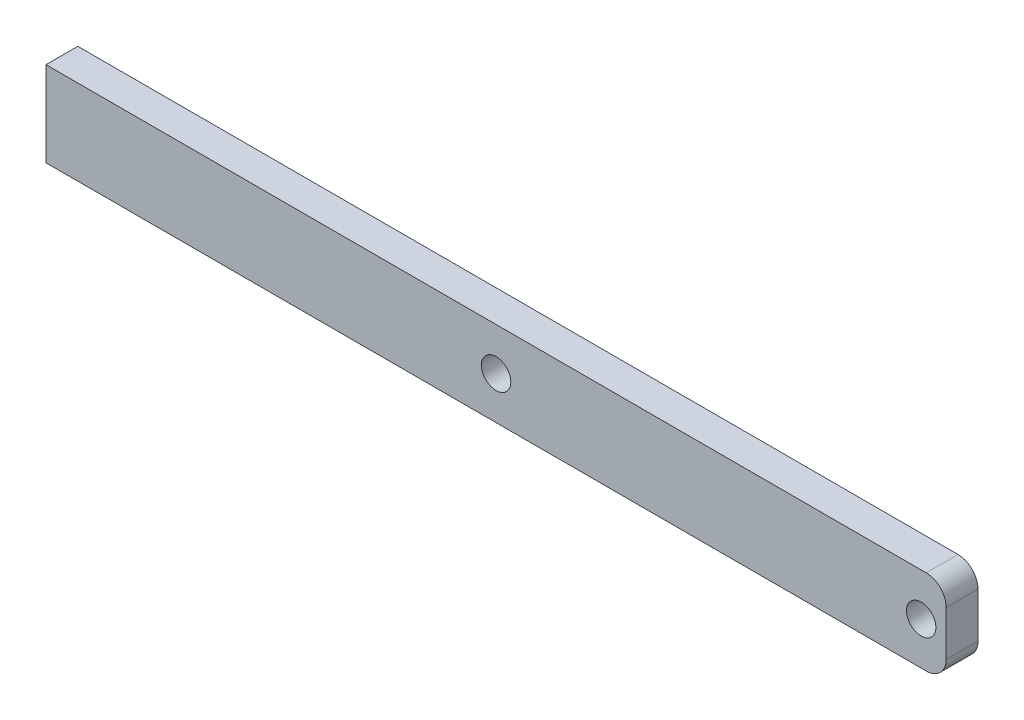
ISO-10303-21;
HEADER;
FILE_DESCRIPTION(('STEP AP214'),'2;1');
FILE_NAME('part.step','',(''),(''),'','','');
FILE_SCHEMA(('AUTOMOTIVE_DESIGN { 1 0 10303 214 1 1 1 1 }'));
ENDSEC;
DATA;
#1=APPLICATION_CONTEXT('core data for automotive mechanical design processes');
#2=APPLICATION_PROTOCOL_DEFINITION('international standard','automotive_design',2000,#1);
#3=PRODUCT_CONTEXT('',#1,'mechanical');
#4=PRODUCT('Part','Part','',(#3));
#5=PRODUCT_RELATED_PRODUCT_CATEGORY('part','',(#4));
#6=PRODUCT_DEFINITION_FORMATION('','',#4);
#7=PRODUCT_DEFINITION_CONTEXT('part definition',#1,'design');
#8=PRODUCT_DEFINITION('design','',#6,#7);
#9=PRODUCT_DEFINITION_SHAPE('','',#8);
#10=(LENGTH_UNIT() NAMED_UNIT(*) SI_UNIT(.MILLI.,.METRE.));
#11=(NAMED_UNIT(*) PLANE_ANGLE_UNIT() SI_UNIT($,.RADIAN.));
#12=(NAMED_UNIT(*) SI_UNIT($,.STERADIAN.) SOLID_ANGLE_UNIT());
#13=UNCERTAINTY_MEASURE_WITH_UNIT(LENGTH_MEASURE(1.E-05),#10,'distance_accuracy_value','');
#14=(GEOMETRIC_REPRESENTATION_CONTEXT(3) GLOBAL_UNCERTAINTY_ASSIGNED_CONTEXT((#13)) GLOBAL_UNIT_ASSIGNED_CONTEXT((#10,
#11,#12)) REPRESENTATION_CONTEXT('',''));
#15=CARTESIAN_POINT('',(0.,0.,0.));
#16=DIRECTION('',(0.,0.,1.));
#17=DIRECTION('',(1.,0.,0.));
#18=AXIS2_PLACEMENT_3D('',#15,#16,#17);
#19=CARTESIAN_POINT('',(0.,0.,3.18));
#20=DIRECTION('',(0.,0.,-1.));
#21=DIRECTION('',(-1.,0.,0.));
#22=AXIS2_PLACEMENT_3D('',#19,#20,#21);
#23=PLANE('',#22);
#24=CARTESIAN_POINT('',(45.,4.25,3.18));
#25=DIRECTION('',(0.,0.,1.));
#26=DIRECTION('',(1.,0.,0.));
#27=AXIS2_PLACEMENT_3D('',#24,#25,#26);
#28=CIRCLE('',#27,1.47);
#29=CARTESIAN_POINT('',(46.47,4.25,3.18));
#30=VERTEX_POINT('',#29);
#31=EDGE_CURVE('E237',#30,#30,#28,.T.);
#32=ORIENTED_EDGE('',*,*,#31,.F.);
#33=EDGE_LOOP('',(#32));
#34=FACE_BOUND('',#33,.T.);
#35=DIRECTION('',(1.,0.,0.));
#36=VECTOR('',#35,1.);
#37=CARTESIAN_POINT('',(0.,0.,3.18));
#38=LINE('',#37,#36);
#39=CARTESIAN_POINT('',(0.,0.,3.18));
#40=VERTEX_POINT('',#39);
#41=CARTESIAN_POINT('',(88.,0.,3.18));
#42=VERTEX_POINT('',#41);
#43=EDGE_CURVE('E86',#40,#42,#38,.T.);
#44=ORIENTED_EDGE('',*,*,#43,.T.);
#45=CARTESIAN_POINT('',(88.,2.,3.18));
#46=DIRECTION('',(0.,0.,-1.));
#47=DIRECTION('',(-1.,0.,0.));
#48=AXIS2_PLACEMENT_3D('',#45,#46,#47);
#49=CIRCLE('',#48,2.);
#50=CARTESIAN_POINT('',(90.,2.,3.18));
#51=VERTEX_POINT('',#50);
#52=EDGE_CURVE('E41',#42,#51,#49,.F.);
#53=ORIENTED_EDGE('',*,*,#52,.T.);
#54=DIRECTION('',(0.,1.,0.));
#55=VECTOR('',#54,1.);
#56=CARTESIAN_POINT('',(90.,0.,3.18));
#57=LINE('',#56,#55);
#58=CARTESIAN_POINT('',(90.,6.5,3.18));
#59=VERTEX_POINT('',#58);
#60=EDGE_CURVE('E93',#51,#59,#57,.T.);
#61=ORIENTED_EDGE('',*,*,#60,.T.);
#62=CARTESIAN_POINT('',(88.,6.5,3.18));
#63=DIRECTION('',(0.,0.,-1.));
#64=DIRECTION('',(-1.,0.,0.));
#65=AXIS2_PLACEMENT_3D('',#62,#63,#64);
#66=CIRCLE('',#65,2.);
#67=CARTESIAN_POINT('',(88.,8.5,3.18));
#68=VERTEX_POINT('',#67);
#69=EDGE_CURVE('E48',#59,#68,#66,.F.);
#70=ORIENTED_EDGE('',*,*,#69,.T.);
#71=DIRECTION('',(-1.,0.,0.));
#72=VECTOR('',#71,1.);
#73=CARTESIAN_POINT('',(0.,8.5,3.18));
#74=LINE('',#73,#72);
#75=CARTESIAN_POINT('',(0.,8.5,3.18));
#76=VERTEX_POINT('',#75);
#77=EDGE_CURVE('E98',#68,#76,#74,.T.);
#78=ORIENTED_EDGE('',*,*,#77,.T.);
#79=DIRECTION('',(0.,-1.,0.));
#80=VECTOR('',#79,1.);
#81=CARTESIAN_POINT('',(0.,0.,3.18));
#82=LINE('',#81,#80);
#83=EDGE_CURVE('E94',#76,#40,#82,.T.);
#84=ORIENTED_EDGE('',*,*,#83,.T.);
#85=EDGE_LOOP('',(#44,#53,#61,#70,#78,#84));
#86=FACE_BOUND('',#85,.T.);
#87=CARTESIAN_POINT('',(87.5,4.24999999999999,3.18));
#88=DIRECTION('',(0.,0.,1.));
#89=DIRECTION('',(1.,0.,0.));
#90=AXIS2_PLACEMENT_3D('',#87,#88,#89);
#91=CIRCLE('',#90,1.47);
#92=CARTESIAN_POINT('',(86.03,4.24999999999999,3.18));
#93=VERTEX_POINT('',#92);
#94=EDGE_CURVE('E139',#93,#93,#91,.T.);
#95=ORIENTED_EDGE('',*,*,#94,.F.);
#96=EDGE_LOOP('',(#95));
#97=FACE_BOUND('',#96,.T.);
#98=ADVANCED_FACE('F33',(#34,#86,#97),#23,.F.);
#99=CARTESIAN_POINT('',(0.,0.,0.));
#100=DIRECTION('',(0.,0.,-1.));
#101=DIRECTION('',(-1.,0.,0.));
#102=AXIS2_PLACEMENT_3D('',#99,#100,#101);
#103=PLANE('',#102);
#104=CARTESIAN_POINT('',(45.,4.25,0.));
#105=DIRECTION('',(0.,0.,1.));
#106=DIRECTION('',(1.,0.,0.));
#107=AXIS2_PLACEMENT_3D('',#104,#105,#106);
#108=CIRCLE('',#107,1.47);
#109=CARTESIAN_POINT('',(46.47,4.25,0.));
#110=VERTEX_POINT('',#109);
#111=EDGE_CURVE('E235',#110,#110,#108,.T.);
#112=ORIENTED_EDGE('',*,*,#111,.T.);
#113=EDGE_LOOP('',(#112));
#114=FACE_BOUND('',#113,.T.);
#115=DIRECTION('',(0.,1.,0.));
#116=VECTOR('',#115,1.);
#117=CARTESIAN_POINT('',(90.,0.,0.));
#118=LINE('',#117,#116);
#119=CARTESIAN_POINT('',(90.,2.,0.));
#120=VERTEX_POINT('',#119);
#121=CARTESIAN_POINT('',(90.,6.5,0.));
#122=VERTEX_POINT('',#121);
#123=EDGE_CURVE('E136',#120,#122,#118,.T.);
#124=ORIENTED_EDGE('',*,*,#123,.F.);
#125=CARTESIAN_POINT('',(88.,2.,0.));
#126=DIRECTION('',(0.,0.,-1.));
#127=DIRECTION('',(-1.,0.,0.));
#128=AXIS2_PLACEMENT_3D('',#125,#126,#127);
#129=CIRCLE('',#128,2.);
#130=CARTESIAN_POINT('',(88.,0.,0.));
#131=VERTEX_POINT('',#130);
#132=EDGE_CURVE('E119',#120,#131,#129,.T.);
#133=ORIENTED_EDGE('',*,*,#132,.T.);
#134=DIRECTION('',(1.,0.,0.));
#135=VECTOR('',#134,1.);
#136=CARTESIAN_POINT('',(0.,0.,0.));
#137=LINE('',#136,#135);
#138=CARTESIAN_POINT('',(0.,0.,0.));
#139=VERTEX_POINT('',#138);
#140=EDGE_CURVE('E135',#139,#131,#137,.T.);
#141=ORIENTED_EDGE('',*,*,#140,.F.);
#142=DIRECTION('',(0.,-1.,0.));
#143=VECTOR('',#142,1.);
#144=CARTESIAN_POINT('',(0.,0.,0.));
#145=LINE('',#144,#143);
#146=CARTESIAN_POINT('',(0.,8.5,0.));
#147=VERTEX_POINT('',#146);
#148=EDGE_CURVE('E106',#147,#139,#145,.T.);
#149=ORIENTED_EDGE('',*,*,#148,.F.);
#150=DIRECTION('',(-1.,0.,0.));
#151=VECTOR('',#150,1.);
#152=CARTESIAN_POINT('',(0.,8.5,0.));
#153=LINE('',#152,#151);
#154=CARTESIAN_POINT('',(88.,8.5,0.));
#155=VERTEX_POINT('',#154);
#156=EDGE_CURVE('E102',#155,#147,#153,.T.);
#157=ORIENTED_EDGE('',*,*,#156,.F.);
#158=CARTESIAN_POINT('',(88.,6.5,0.));
#159=DIRECTION('',(0.,0.,-1.));
#160=DIRECTION('',(-1.,0.,0.));
#161=AXIS2_PLACEMENT_3D('',#158,#159,#160);
#162=CIRCLE('',#161,2.);
#163=EDGE_CURVE('E117',#155,#122,#162,.T.);
#164=ORIENTED_EDGE('',*,*,#163,.T.);
#165=EDGE_LOOP('',(#124,#133,#141,#149,#157,#164));
#166=FACE_BOUND('',#165,.T.);
#167=CARTESIAN_POINT('',(87.5,4.24999999999999,0.));
#168=DIRECTION('',(0.,0.,1.));
#169=DIRECTION('',(1.,0.,0.));
#170=AXIS2_PLACEMENT_3D('',#167,#168,#169);
#171=CIRCLE('',#170,1.47);
#172=CARTESIAN_POINT('',(86.03,4.24999999999999,0.));
#173=VERTEX_POINT('',#172);
#174=EDGE_CURVE('E239',#173,#173,#171,.T.);
#175=ORIENTED_EDGE('',*,*,#174,.T.);
#176=EDGE_LOOP('',(#175));
#177=FACE_BOUND('',#176,.T.);
#178=ADVANCED_FACE('F133',(#114,#166,#177),#103,.T.);
#179=CARTESIAN_POINT('',(0.,0.,3.18));
#180=DIRECTION('',(1.,0.,0.));
#181=DIRECTION('',(0.,0.,-1.));
#182=AXIS2_PLACEMENT_3D('',#179,#180,#181);
#183=PLANE('',#182);
#184=ORIENTED_EDGE('',*,*,#148,.T.);
#185=DIRECTION('',(0.,0.,-1.));
#186=VECTOR('',#185,1.);
#187=CARTESIAN_POINT('',(0.,0.,3.18));
#188=LINE('',#187,#186);
#189=EDGE_CURVE('E90',#40,#139,#188,.T.);
#190=ORIENTED_EDGE('',*,*,#189,.F.);
#191=ORIENTED_EDGE('',*,*,#83,.F.);
#192=DIRECTION('',(0.,0.,-1.));
#193=VECTOR('',#192,1.);
#194=CARTESIAN_POINT('',(0.,8.5,3.18));
#195=LINE('',#194,#193);
#196=EDGE_CURVE('E108',#76,#147,#195,.T.);
#197=ORIENTED_EDGE('',*,*,#196,.T.);
#198=EDGE_LOOP('',(#184,#190,#191,#197));
#199=FACE_BOUND('',#198,.T.);
#200=ADVANCED_FACE('F104',(#199),#183,.F.);
#201=CARTESIAN_POINT('',(0.,0.,3.18));
#202=DIRECTION('',(0.,1.,0.));
#203=DIRECTION('',(0.,0.,1.));
#204=AXIS2_PLACEMENT_3D('',#201,#202,#203);
#205=PLANE('',#204);
#206=ORIENTED_EDGE('',*,*,#140,.T.);
#207=DIRECTION('',(0.,0.,-1.));
#208=VECTOR('',#207,1.);
#209=CARTESIAN_POINT('',(88.,0.,3.18));
#210=LINE('',#209,#208);
#211=EDGE_CURVE('E56',#131,#42,#210,.F.);
#212=ORIENTED_EDGE('',*,*,#211,.T.);
#213=ORIENTED_EDGE('',*,*,#43,.F.);
#214=ORIENTED_EDGE('',*,*,#189,.T.);
#215=EDGE_LOOP('',(#206,#212,#213,#214));
#216=FACE_BOUND('',#215,.T.);
#217=ADVANCED_FACE('F88',(#216),#205,.F.);
#218=CARTESIAN_POINT('',(90.,0.,3.18));
#219=DIRECTION('',(-1.,0.,0.));
#220=DIRECTION('',(0.,0.,1.));
#221=AXIS2_PLACEMENT_3D('',#218,#219,#220);
#222=PLANE('',#221);
#223=ORIENTED_EDGE('',*,*,#60,.F.);
#224=DIRECTION('',(0.,0.,-1.));
#225=VECTOR('',#224,1.);
#226=CARTESIAN_POINT('',(90.,2.,3.18));
#227=LINE('',#226,#225);
#228=EDGE_CURVE('E110',#51,#120,#227,.T.);
#229=ORIENTED_EDGE('',*,*,#228,.T.);
#230=ORIENTED_EDGE('',*,*,#123,.T.);
#231=DIRECTION('',(0.,0.,-1.));
#232=VECTOR('',#231,1.);
#233=CARTESIAN_POINT('',(90.,6.5,3.18));
#234=LINE('',#233,#232);
#235=EDGE_CURVE('E107',#122,#59,#234,.F.);
#236=ORIENTED_EDGE('',*,*,#235,.T.);
#237=EDGE_LOOP('',(#223,#229,#230,#236));
#238=FACE_BOUND('',#237,.T.);
#239=ADVANCED_FACE('F126',(#238),#222,.F.);
#240=CARTESIAN_POINT('',(0.,8.5,3.18));
#241=DIRECTION('',(0.,-1.,0.));
#242=DIRECTION('',(0.,0.,-1.));
#243=AXIS2_PLACEMENT_3D('',#240,#241,#242);
#244=PLANE('',#243);
#245=ORIENTED_EDGE('',*,*,#77,.F.);
#246=DIRECTION('',(0.,0.,-1.));
#247=VECTOR('',#246,1.);
#248=CARTESIAN_POINT('',(88.,8.5,3.18));
#249=LINE('',#248,#247);
#250=EDGE_CURVE('E11',#68,#155,#249,.T.);
#251=ORIENTED_EDGE('',*,*,#250,.T.);
#252=ORIENTED_EDGE('',*,*,#156,.T.);
#253=ORIENTED_EDGE('',*,*,#196,.F.);
#254=EDGE_LOOP('',(#245,#251,#252,#253));
#255=FACE_BOUND('',#254,.T.);
#256=ADVANCED_FACE('F144',(#255),#244,.F.);
#257=CARTESIAN_POINT('',(87.5,4.24999999999999,3.18));
#258=DIRECTION('',(0.,0.,-1.));
#259=DIRECTION('',(-1.,0.,0.));
#260=AXIS2_PLACEMENT_3D('',#257,#258,#259);
#261=CYLINDRICAL_SURFACE('',#260,1.47);
#262=CARTESIAN_POINT('',(86.03,4.24999999999999,3.18));
#263=CARTESIAN_POINT('',(86.03,4.24999999999999,3.146875));
#264=CARTESIAN_POINT('',(86.03,4.24999999999999,3.11375));
#265=CARTESIAN_POINT('',(86.03,4.24999999999999,3.0475));
#266=CARTESIAN_POINT('',(86.03,4.24999999999999,3.014375));
#267=CARTESIAN_POINT('',(86.03,4.24999999999999,2.948125));
#268=CARTESIAN_POINT('',(86.03,4.24999999999999,2.915));
#269=CARTESIAN_POINT('',(86.03,4.24999999999999,2.84875));
#270=CARTESIAN_POINT('',(86.03,4.24999999999999,2.815625));
#271=CARTESIAN_POINT('',(86.03,4.24999999999999,2.749375));
#272=CARTESIAN_POINT('',(86.03,4.24999999999999,2.71625));
#273=CARTESIAN_POINT('',(86.03,4.24999999999999,2.65));
#274=CARTESIAN_POINT('',(86.03,4.24999999999999,2.616875));
#275=CARTESIAN_POINT('',(86.03,4.24999999999999,2.550625));
#276=CARTESIAN_POINT('',(86.03,4.24999999999999,2.5175));
#277=CARTESIAN_POINT('',(86.03,4.24999999999999,2.45125));
#278=CARTESIAN_POINT('',(86.03,4.24999999999999,2.418125));
#279=CARTESIAN_POINT('',(86.03,4.24999999999999,2.351875));
#280=CARTESIAN_POINT('',(86.03,4.24999999999999,2.31875));
#281=CARTESIAN_POINT('',(86.03,4.24999999999999,2.2525));
#282=CARTESIAN_POINT('',(86.03,4.24999999999999,2.219375));
#283=CARTESIAN_POINT('',(86.03,4.24999999999999,2.153125));
#284=CARTESIAN_POINT('',(86.03,4.24999999999999,2.12));
#285=CARTESIAN_POINT('',(86.03,4.24999999999999,2.05375));
#286=CARTESIAN_POINT('',(86.03,4.24999999999999,2.020625));
#287=CARTESIAN_POINT('',(86.03,4.24999999999999,1.954375));
#288=CARTESIAN_POINT('',(86.03,4.24999999999999,1.92125));
#289=CARTESIAN_POINT('',(86.03,4.24999999999999,1.855));
#290=CARTESIAN_POINT('',(86.03,4.24999999999999,1.821875));
#291=CARTESIAN_POINT('',(86.03,4.24999999999999,1.755625));
#292=CARTESIAN_POINT('',(86.03,4.24999999999999,1.7225));
#293=CARTESIAN_POINT('',(86.03,4.24999999999999,1.65625));
#294=CARTESIAN_POINT('',(86.03,4.24999999999999,1.623125));
#295=CARTESIAN_POINT('',(86.03,4.24999999999999,1.556875));
#296=CARTESIAN_POINT('',(86.03,4.24999999999999,1.52375));
#297=CARTESIAN_POINT('',(86.03,4.24999999999999,1.4575));
#298=CARTESIAN_POINT('',(86.03,4.24999999999999,1.424375));
#299=CARTESIAN_POINT('',(86.03,4.24999999999999,1.358125));
#300=CARTESIAN_POINT('',(86.03,4.24999999999999,1.325));
#301=CARTESIAN_POINT('',(86.03,4.24999999999999,1.25875));
#302=CARTESIAN_POINT('',(86.03,4.24999999999999,1.225625));
#303=CARTESIAN_POINT('',(86.03,4.24999999999999,1.159375));
#304=CARTESIAN_POINT('',(86.03,4.24999999999999,1.12625));
#305=CARTESIAN_POINT('',(86.03,4.24999999999999,1.06));
#306=CARTESIAN_POINT('',(86.03,4.24999999999999,1.026875));
#307=CARTESIAN_POINT('',(86.03,4.24999999999999,0.960625));
#308=CARTESIAN_POINT('',(86.03,4.24999999999999,0.9275));
#309=CARTESIAN_POINT('',(86.03,4.24999999999999,0.86125));
#310=CARTESIAN_POINT('',(86.03,4.24999999999999,0.828125));
#311=CARTESIAN_POINT('',(86.03,4.24999999999999,0.761875));
#312=CARTESIAN_POINT('',(86.03,4.24999999999999,0.72875));
#313=CARTESIAN_POINT('',(86.03,4.24999999999999,0.6625));
#314=CARTESIAN_POINT('',(86.03,4.24999999999999,0.629375));
#315=CARTESIAN_POINT('',(86.03,4.24999999999999,0.563125));
#316=CARTESIAN_POINT('',(86.03,4.24999999999999,0.53));
#317=CARTESIAN_POINT('',(86.03,4.24999999999999,0.46375));
#318=CARTESIAN_POINT('',(86.03,4.24999999999999,0.430625));
#319=CARTESIAN_POINT('',(86.03,4.24999999999999,0.364375));
#320=CARTESIAN_POINT('',(86.03,4.24999999999999,0.33125));
#321=CARTESIAN_POINT('',(86.03,4.24999999999999,0.265));
#322=CARTESIAN_POINT('',(86.03,4.24999999999999,0.231875));
#323=CARTESIAN_POINT('',(86.03,4.24999999999999,0.165625));
#324=CARTESIAN_POINT('',(86.03,4.24999999999999,0.1325));
#325=CARTESIAN_POINT('',(86.03,4.24999999999999,0.06625));
#326=CARTESIAN_POINT('',(86.03,4.24999999999999,0.033125));
#327=CARTESIAN_POINT('',(86.03,4.24999999999999,0.));
#328=B_SPLINE_CURVE_WITH_KNOTS('',3,(#262,#263,#264,#265,#266,#267,#268,#269,#270,#271,#272,
#273,#274,#275,#276,#277,#278,#279,#280,#281,#282,#283,#284,#285,#286,#287,#288,#289,#290,#291,
#292,#293,#294,#295,#296,#297,#298,#299,#300,#301,#302,#303,#304,#305,#306,#307,#308,#309,#310,
#311,#312,#313,#314,#315,#316,#317,#318,#319,#320,#321,#322,#323,#324,#325,#326,#327),
.UNSPECIFIED.,.F.,.F.,(4,2,2,2,2,2,2,2,2,2,2,2,2,2,2,2,2,2,2,2,2,2,2,2,2,2,2,2,2,2,2,2,4),(0.,
0.0993750000000001,0.19875,0.298125,0.3975,0.496875,0.59625,0.695625,0.795,0.894375,0.99375,
1.093125,1.1925,1.291875,1.39125,1.490625,1.59,1.689375,1.78875,1.888125,1.9875,2.086875,
2.18625,2.285625,2.385,2.484375,2.58375,2.683125,2.7825,2.881875,2.98125,3.080625,3.18),.UNSPECIFIED.);
#329=EDGE_CURVE('BSEAM162',#93,#173,#328,.T.);
#330=ORIENTED_EDGE('',*,*,#94,.T.);
#331=ORIENTED_EDGE('',*,*,#174,.F.);
#332=ORIENTED_EDGE('',*,*,#329,.T.);
#333=ORIENTED_EDGE('',*,*,#329,.F.);
#334=EDGE_LOOP('',(#330,#332,#331,#333));
#335=FACE_BOUND('',#334,.T.);
#336=ADVANCED_FACE('F162',(#335),#261,.F.);
#337=CARTESIAN_POINT('',(45.,4.25,0.));
#338=DIRECTION('',(0.,0.,1.));
#339=DIRECTION('',(1.,0.,0.));
#340=AXIS2_PLACEMENT_3D('',#337,#338,#339);
#341=CYLINDRICAL_SURFACE('',#340,1.47);
#342=CARTESIAN_POINT('',(46.47,4.25,0.));
#343=CARTESIAN_POINT('',(46.47,4.25,0.033125));
#344=CARTESIAN_POINT('',(46.47,4.25,0.06625));
#345=CARTESIAN_POINT('',(46.47,4.25,0.1325));
#346=CARTESIAN_POINT('',(46.47,4.25,0.165625));
#347=CARTESIAN_POINT('',(46.47,4.25,0.231875));
#348=CARTESIAN_POINT('',(46.47,4.25,0.265));
#349=CARTESIAN_POINT('',(46.47,4.25,0.33125));
#350=CARTESIAN_POINT('',(46.47,4.25,0.364375));
#351=CARTESIAN_POINT('',(46.47,4.25,0.430625));
#352=CARTESIAN_POINT('',(46.47,4.25,0.46375));
#353=CARTESIAN_POINT('',(46.47,4.25,0.53));
#354=CARTESIAN_POINT('',(46.47,4.25,0.563125));
#355=CARTESIAN_POINT('',(46.47,4.25,0.629375));
#356=CARTESIAN_POINT('',(46.47,4.25,0.6625));
#357=CARTESIAN_POINT('',(46.47,4.25,0.72875));
#358=CARTESIAN_POINT('',(46.47,4.25,0.761875));
#359=CARTESIAN_POINT('',(46.47,4.25,0.828125));
#360=CARTESIAN_POINT('',(46.47,4.25,0.86125));
#361=CARTESIAN_POINT('',(46.47,4.25,0.9275));
#362=CARTESIAN_POINT('',(46.47,4.25,0.960625));
#363=CARTESIAN_POINT('',(46.47,4.25,1.026875));
#364=CARTESIAN_POINT('',(46.47,4.25,1.06));
#365=CARTESIAN_POINT('',(46.47,4.25,1.12625));
#366=CARTESIAN_POINT('',(46.47,4.25,1.159375));
#367=CARTESIAN_POINT('',(46.47,4.25,1.225625));
#368=CARTESIAN_POINT('',(46.47,4.25,1.25875));
#369=CARTESIAN_POINT('',(46.47,4.25,1.325));
#370=CARTESIAN_POINT('',(46.47,4.25,1.358125));
#371=CARTESIAN_POINT('',(46.47,4.25,1.424375));
#372=CARTESIAN_POINT('',(46.47,4.25,1.4575));
#373=CARTESIAN_POINT('',(46.47,4.25,1.52375));
#374=CARTESIAN_POINT('',(46.47,4.25,1.556875));
#375=CARTESIAN_POINT('',(46.47,4.25,1.623125));
#376=CARTESIAN_POINT('',(46.47,4.25,1.65625));
#377=CARTESIAN_POINT('',(46.47,4.25,1.7225));
#378=CARTESIAN_POINT('',(46.47,4.25,1.755625));
#379=CARTESIAN_POINT('',(46.47,4.25,1.821875));
#380=CARTESIAN_POINT('',(46.47,4.25,1.855));
#381=CARTESIAN_POINT('',(46.47,4.25,1.92125));
#382=CARTESIAN_POINT('',(46.47,4.25,1.954375));
#383=CARTESIAN_POINT('',(46.47,4.25,2.020625));
#384=CARTESIAN_POINT('',(46.47,4.25,2.05375));
#385=CARTESIAN_POINT('',(46.47,4.25,2.12));
#386=CARTESIAN_POINT('',(46.47,4.25,2.153125));
#387=CARTESIAN_POINT('',(46.47,4.25,2.219375));
#388=CARTESIAN_POINT('',(46.47,4.25,2.2525));
#389=CARTESIAN_POINT('',(46.47,4.25,2.31875));
#390=CARTESIAN_POINT('',(46.47,4.25,2.351875));
#391=CARTESIAN_POINT('',(46.47,4.25,2.418125));
#392=CARTESIAN_POINT('',(46.47,4.25,2.45125));
#393=CARTESIAN_POINT('',(46.47,4.25,2.5175));
#394=CARTESIAN_POINT('',(46.47,4.25,2.550625));
#395=CARTESIAN_POINT('',(46.47,4.25,2.616875));
#396=CARTESIAN_POINT('',(46.47,4.25,2.65));
#397=CARTESIAN_POINT('',(46.47,4.25,2.71625));
#398=CARTESIAN_POINT('',(46.47,4.25,2.749375));
#399=CARTESIAN_POINT('',(46.47,4.25,2.815625));
#400=CARTESIAN_POINT('',(46.47,4.25,2.84875));
#401=CARTESIAN_POINT('',(46.47,4.25,2.915));
#402=CARTESIAN_POINT('',(46.47,4.25,2.948125));
#403=CARTESIAN_POINT('',(46.47,4.25,3.014375));
#404=CARTESIAN_POINT('',(46.47,4.25,3.0475));
#405=CARTESIAN_POINT('',(46.47,4.25,3.11375));
#406=CARTESIAN_POINT('',(46.47,4.25,3.146875));
#407=CARTESIAN_POINT('',(46.47,4.25,3.18));
#408=B_SPLINE_CURVE_WITH_KNOTS('',3,(#342,#343,#344,#345,#346,#347,#348,#349,#350,#351,#352,
#353,#354,#355,#356,#357,#358,#359,#360,#361,#362,#363,#364,#365,#366,#367,#368,#369,#370,#371,
#372,#373,#374,#375,#376,#377,#378,#379,#380,#381,#382,#383,#384,#385,#386,#387,#388,#389,#390,
#391,#392,#393,#394,#395,#396,#397,#398,#399,#400,#401,#402,#403,#404,#405,#406,#407),
.UNSPECIFIED.,.F.,.F.,(4,2,2,2,2,2,2,2,2,2,2,2,2,2,2,2,2,2,2,2,2,2,2,2,2,2,2,2,2,2,2,2,4),(0.,
0.099375,0.19875,0.298125,0.3975,0.496875,0.59625,0.695625,0.795,0.894375,0.99375,1.093125,
1.1925,1.291875,1.39125,1.490625,1.59,1.689375,1.78875,1.888125,1.9875,2.086875,2.18625,
2.285625,2.385,2.484375,2.58375,2.683125,2.7825,2.881875,2.98125,3.080625,3.18),.UNSPECIFIED.);
#409=EDGE_CURVE('BSEAM151',#110,#30,#408,.T.);
#410=ORIENTED_EDGE('',*,*,#111,.F.);
#411=ORIENTED_EDGE('',*,*,#31,.T.);
#412=ORIENTED_EDGE('',*,*,#409,.T.);
#413=ORIENTED_EDGE('',*,*,#409,.F.);
#414=EDGE_LOOP('',(#410,#412,#411,#413));
#415=FACE_BOUND('',#414,.T.);
#416=ADVANCED_FACE('F151',(#415),#341,.F.);
#417=CARTESIAN_POINT('',(88.,2.,3.18));
#418=DIRECTION('',(0.,0.,-1.));
#419=DIRECTION('',(-1.,0.,0.));
#420=AXIS2_PLACEMENT_3D('',#417,#418,#419);
#421=CYLINDRICAL_SURFACE('',#420,2.);
#422=ORIENTED_EDGE('',*,*,#52,.F.);
#423=ORIENTED_EDGE('',*,*,#211,.F.);
#424=ORIENTED_EDGE('',*,*,#132,.F.);
#425=ORIENTED_EDGE('',*,*,#228,.F.);
#426=EDGE_LOOP('',(#422,#423,#424,#425));
#427=FACE_BOUND('',#426,.T.);
#428=ADVANCED_FACE('F131',(#427),#421,.T.);
#429=CARTESIAN_POINT('',(88.,6.5,3.18));
#430=DIRECTION('',(0.,0.,-1.));
#431=DIRECTION('',(-1.,0.,0.));
#432=AXIS2_PLACEMENT_3D('',#429,#430,#431);
#433=CYLINDRICAL_SURFACE('',#432,2.);
#434=ORIENTED_EDGE('',*,*,#69,.F.);
#435=ORIENTED_EDGE('',*,*,#235,.F.);
#436=ORIENTED_EDGE('',*,*,#163,.F.);
#437=ORIENTED_EDGE('',*,*,#250,.F.);
#438=EDGE_LOOP('',(#434,#435,#436,#437));
#439=FACE_BOUND('',#438,.T.);
#440=ADVANCED_FACE('F35',(#439),#433,.T.);
#441=CLOSED_SHELL('',(#98,#178,#200,#217,#239,#256,#336,#416,#428,#440));
#442=MANIFOLD_SOLID_BREP('B2',#441);
#443=ADVANCED_BREP_SHAPE_REPRESENTATION('',(#18,#442),#14);
#444=SHAPE_DEFINITION_REPRESENTATION(#9,#443);
ENDSEC;
END-ISO-10303-21;
